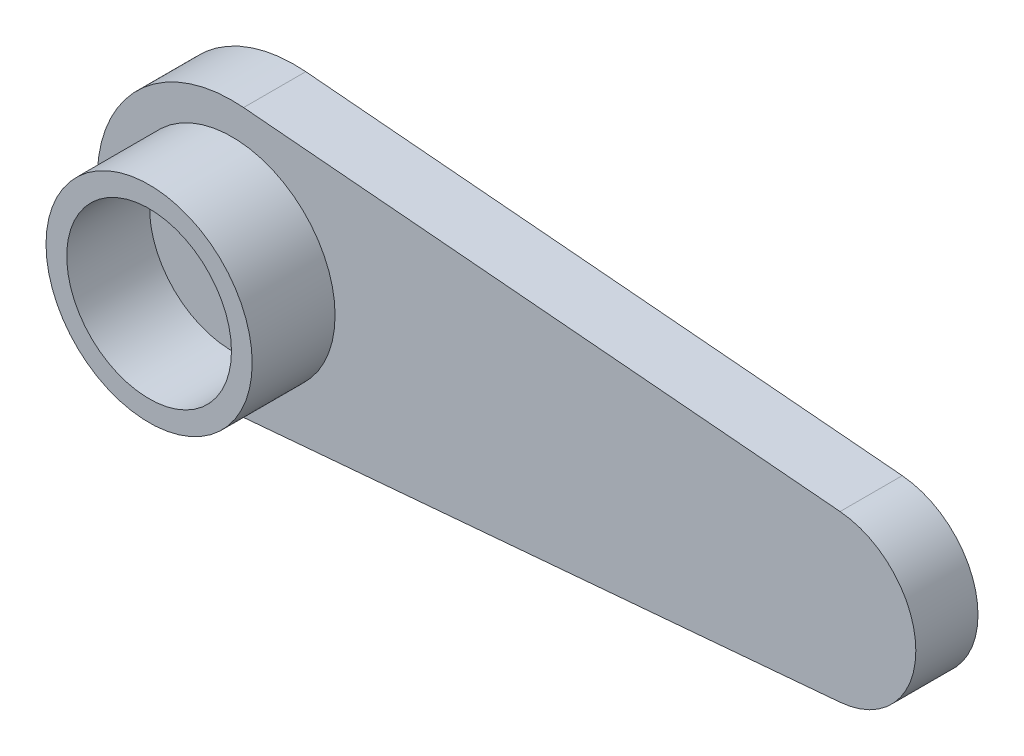
ISO-10303-21;
HEADER;
FILE_DESCRIPTION(('STEP AP214'),'2;1');
FILE_NAME('part.step','',(''),(''),'','','');
FILE_SCHEMA(('AUTOMOTIVE_DESIGN { 1 0 10303 214 1 1 1 1 }'));
ENDSEC;
DATA;
#1=APPLICATION_CONTEXT('core data for automotive mechanical design processes');
#2=APPLICATION_PROTOCOL_DEFINITION('international standard','automotive_design',2000,#1);
#3=PRODUCT_CONTEXT('',#1,'mechanical');
#4=PRODUCT('Part','Part','',(#3));
#5=PRODUCT_RELATED_PRODUCT_CATEGORY('part','',(#4));
#6=PRODUCT_DEFINITION_FORMATION('','',#4);
#7=PRODUCT_DEFINITION_CONTEXT('part definition',#1,'design');
#8=PRODUCT_DEFINITION('design','',#6,#7);
#9=PRODUCT_DEFINITION_SHAPE('','',#8);
#10=(LENGTH_UNIT() NAMED_UNIT(*) SI_UNIT(.MILLI.,.METRE.));
#11=(NAMED_UNIT(*) PLANE_ANGLE_UNIT() SI_UNIT($,.RADIAN.));
#12=(NAMED_UNIT(*) SI_UNIT($,.STERADIAN.) SOLID_ANGLE_UNIT());
#13=UNCERTAINTY_MEASURE_WITH_UNIT(LENGTH_MEASURE(1.E-05),#10,'distance_accuracy_value','');
#14=(GEOMETRIC_REPRESENTATION_CONTEXT(3) GLOBAL_UNCERTAINTY_ASSIGNED_CONTEXT((#13)) GLOBAL_UNIT_ASSIGNED_CONTEXT((#10,
#11,#12)) REPRESENTATION_CONTEXT('',''));
#15=CARTESIAN_POINT('',(0.,0.,0.));
#16=DIRECTION('',(0.,0.,1.));
#17=DIRECTION('',(1.,0.,0.));
#18=AXIS2_PLACEMENT_3D('',#15,#16,#17);
#19=CARTESIAN_POINT('',(-29.1805990323984,0.,3.));
#20=DIRECTION('',(0.,0.,-1.));
#21=DIRECTION('',(-1.,0.,0.));
#22=AXIS2_PLACEMENT_3D('',#19,#20,#21);
#23=CYLINDRICAL_SURFACE('',#22,6.5);
#24=CARTESIAN_POINT('',(-29.1805990323984,0.,0.));
#25=DIRECTION('',(0.,0.,1.));
#26=DIRECTION('',(1.,0.,0.));
#27=AXIS2_PLACEMENT_3D('',#24,#25,#26);
#28=CIRCLE('',#27,6.5);
#29=CARTESIAN_POINT('',(-28.6202542048122,6.47580216453509,0.));
#30=VERTEX_POINT('',#29);
#31=CARTESIAN_POINT('',(-28.6202542048122,-6.47580216453509,0.));
#32=VERTEX_POINT('',#31);
#33=EDGE_CURVE('E105',#30,#32,#28,.T.);
#34=ORIENTED_EDGE('',*,*,#33,.T.);
#35=DIRECTION('',(0.,0.,-1.));
#36=VECTOR('',#35,1.);
#37=CARTESIAN_POINT('',(-28.6202542048122,-6.47580216453509,3.));
#38=LINE('',#37,#36);
#39=CARTESIAN_POINT('',(-28.6202542048122,-6.47580216453509,3.));
#40=VERTEX_POINT('',#39);
#41=EDGE_CURVE('E42',#40,#32,#38,.T.);
#42=ORIENTED_EDGE('',*,*,#41,.F.);
#43=CARTESIAN_POINT('',(-29.1805990323984,0.,3.));
#44=DIRECTION('',(0.,0.,1.));
#45=DIRECTION('',(1.,0.,0.));
#46=AXIS2_PLACEMENT_3D('',#43,#44,#45);
#47=CIRCLE('',#46,6.5);
#48=CARTESIAN_POINT('',(-28.6202542048122,6.47580216453509,3.));
#49=VERTEX_POINT('',#48);
#50=EDGE_CURVE('E92',#49,#40,#47,.T.);
#51=ORIENTED_EDGE('',*,*,#50,.F.);
#52=DIRECTION('',(0.,0.,-1.));
#53=VECTOR('',#52,1.);
#54=CARTESIAN_POINT('',(-28.6202542048122,6.47580216453509,3.));
#55=LINE('',#54,#53);
#56=EDGE_CURVE('E101',#49,#30,#55,.T.);
#57=ORIENTED_EDGE('',*,*,#56,.T.);
#58=EDGE_LOOP('',(#34,#42,#51,#57));
#59=FACE_BOUND('',#58,.T.);
#60=ADVANCED_FACE('F39',(#59),#23,.T.);
#61=CARTESIAN_POINT('',(-28.6202542048122,-6.47580216453509,3.));
#62=DIRECTION('',(-0.0862068965517242,0.996277256082322,0.));
#63=DIRECTION('',(-0.996277256082322,-0.0862068965517242,0.));
#64=AXIS2_PLACEMENT_3D('',#61,#62,#63);
#65=PLANE('',#64);
#66=DIRECTION('',(0.996277256082322,0.0862068965517242,0.));
#67=VECTOR('',#66,1.);
#68=CARTESIAN_POINT('',(-28.6202542048122,-6.47580216453509,0.));
#69=LINE('',#68,#67);
#70=CARTESIAN_POINT('',(0.164228553808478,-3.98510902432929,0.));
#71=VERTEX_POINT('',#70);
#72=EDGE_CURVE('E97',#32,#71,#69,.T.);
#73=ORIENTED_EDGE('',*,*,#72,.T.);
#74=DIRECTION('',(0.,0.,-1.));
#75=VECTOR('',#74,1.);
#76=CARTESIAN_POINT('',(0.164228553808478,-3.98510902432929,3.));
#77=LINE('',#76,#75);
#78=CARTESIAN_POINT('',(0.164228553808478,-3.98510902432929,3.));
#79=VERTEX_POINT('',#78);
#80=EDGE_CURVE('E95',#79,#71,#77,.T.);
#81=ORIENTED_EDGE('',*,*,#80,.F.);
#82=DIRECTION('',(0.996277256082322,0.0862068965517242,0.));
#83=VECTOR('',#82,1.);
#84=CARTESIAN_POINT('',(-28.6202542048122,-6.47580216453509,3.));
#85=LINE('',#84,#83);
#86=EDGE_CURVE('E87',#40,#79,#85,.T.);
#87=ORIENTED_EDGE('',*,*,#86,.F.);
#88=ORIENTED_EDGE('',*,*,#41,.T.);
#89=EDGE_LOOP('',(#73,#81,#87,#88));
#90=FACE_BOUND('',#89,.T.);
#91=ADVANCED_FACE('F96',(#90),#65,.F.);
#92=CARTESIAN_POINT('',(-0.180599032398417,0.,3.));
#93=DIRECTION('',(0.,0.,-1.));
#94=DIRECTION('',(-1.,0.,0.));
#95=AXIS2_PLACEMENT_3D('',#92,#93,#94);
#96=CYLINDRICAL_SURFACE('',#95,4.);
#97=CARTESIAN_POINT('',(-0.180599032398417,0.,0.));
#98=DIRECTION('',(0.,0.,1.));
#99=DIRECTION('',(1.,0.,0.));
#100=AXIS2_PLACEMENT_3D('',#97,#98,#99);
#101=CIRCLE('',#100,4.);
#102=CARTESIAN_POINT('',(0.164228553808481,3.98510902432929,0.));
#103=VERTEX_POINT('',#102);
#104=EDGE_CURVE('E73',#71,#103,#101,.T.);
#105=ORIENTED_EDGE('',*,*,#104,.T.);
#106=DIRECTION('',(0.,0.,-1.));
#107=VECTOR('',#106,1.);
#108=CARTESIAN_POINT('',(0.164228553808481,3.98510902432929,3.));
#109=LINE('',#108,#107);
#110=CARTESIAN_POINT('',(0.164228553808481,3.98510902432929,3.));
#111=VERTEX_POINT('',#110);
#112=EDGE_CURVE('E98',#111,#103,#109,.T.);
#113=ORIENTED_EDGE('',*,*,#112,.F.);
#114=CARTESIAN_POINT('',(-0.180599032398417,0.,3.));
#115=DIRECTION('',(0.,0.,1.));
#116=DIRECTION('',(1.,0.,0.));
#117=AXIS2_PLACEMENT_3D('',#114,#115,#116);
#118=CIRCLE('',#117,4.);
#119=EDGE_CURVE('E90',#79,#111,#118,.T.);
#120=ORIENTED_EDGE('',*,*,#119,.F.);
#121=ORIENTED_EDGE('',*,*,#80,.T.);
#122=EDGE_LOOP('',(#105,#113,#120,#121));
#123=FACE_BOUND('',#122,.T.);
#124=ADVANCED_FACE('F99',(#123),#96,.T.);
#125=CARTESIAN_POINT('',(-28.6202542048122,6.47580216453509,3.));
#126=DIRECTION('',(-0.0862068965517242,-0.996277256082322,0.));
#127=DIRECTION('',(0.996277256082322,-0.0862068965517242,0.));
#128=AXIS2_PLACEMENT_3D('',#125,#126,#127);
#129=PLANE('',#128);
#130=DIRECTION('',(-0.996277256082322,0.0862068965517242,0.));
#131=VECTOR('',#130,1.);
#132=CARTESIAN_POINT('',(-28.6202542048122,6.47580216453509,0.));
#133=LINE('',#132,#131);
#134=EDGE_CURVE('E79',#103,#30,#133,.T.);
#135=ORIENTED_EDGE('',*,*,#134,.T.);
#136=ORIENTED_EDGE('',*,*,#56,.F.);
#137=DIRECTION('',(-0.996277256082322,0.0862068965517242,0.));
#138=VECTOR('',#137,1.);
#139=CARTESIAN_POINT('',(-28.6202542048122,6.47580216453509,3.));
#140=LINE('',#139,#138);
#141=EDGE_CURVE('E56',#111,#49,#140,.T.);
#142=ORIENTED_EDGE('',*,*,#141,.F.);
#143=ORIENTED_EDGE('',*,*,#112,.T.);
#144=EDGE_LOOP('',(#135,#136,#142,#143));
#145=FACE_BOUND('',#144,.T.);
#146=ADVANCED_FACE('F113',(#145),#129,.F.);
#147=CARTESIAN_POINT('',(-29.1805990323984,0.,3.));
#148=DIRECTION('',(0.,0.,1.));
#149=DIRECTION('',(1.,0.,0.));
#150=AXIS2_PLACEMENT_3D('',#147,#148,#149);
#151=PLANE('',#150);
#152=CARTESIAN_POINT('',(-29.1805990323984,0.,3.));
#153=DIRECTION('',(0.,0.,1.));
#154=DIRECTION('',(1.,0.,0.));
#155=AXIS2_PLACEMENT_3D('',#152,#153,#154);
#156=CIRCLE('',#155,4.975);
#157=CARTESIAN_POINT('',(-24.2055990323984,0.,3.));
#158=VERTEX_POINT('',#157);
#159=EDGE_CURVE('E12',#158,#158,#156,.T.);
#160=ORIENTED_EDGE('',*,*,#159,.F.);
#161=EDGE_LOOP('',(#160));
#162=FACE_BOUND('',#161,.T.);
#163=ORIENTED_EDGE('',*,*,#50,.T.);
#164=ORIENTED_EDGE('',*,*,#86,.T.);
#165=ORIENTED_EDGE('',*,*,#119,.T.);
#166=ORIENTED_EDGE('',*,*,#141,.T.);
#167=EDGE_LOOP('',(#163,#164,#165,#166));
#168=FACE_BOUND('',#167,.T.);
#169=ADVANCED_FACE('F88',(#162,#168),#151,.T.);
#170=CARTESIAN_POINT('',(-29.1805990323984,0.,0.));
#171=DIRECTION('',(0.,0.,1.));
#172=DIRECTION('',(1.,0.,0.));
#173=AXIS2_PLACEMENT_3D('',#170,#171,#172);
#174=PLANE('',#173);
#175=ORIENTED_EDGE('',*,*,#33,.F.);
#176=ORIENTED_EDGE('',*,*,#134,.F.);
#177=ORIENTED_EDGE('',*,*,#104,.F.);
#178=ORIENTED_EDGE('',*,*,#72,.F.);
#179=EDGE_LOOP('',(#175,#176,#177,#178));
#180=FACE_BOUND('',#179,.T.);
#181=ADVANCED_FACE('F116',(#180),#174,.F.);
#182=CARTESIAN_POINT('',(-29.1805990323984,0.,7.));
#183=DIRECTION('',(0.,0.,1.));
#184=DIRECTION('',(1.,0.,0.));
#185=AXIS2_PLACEMENT_3D('',#182,#183,#184);
#186=PLANE('',#185);
#187=CARTESIAN_POINT('',(-29.1805990323984,0.,7.));
#188=DIRECTION('',(0.,0.,1.));
#189=DIRECTION('',(1.,0.,0.));
#190=AXIS2_PLACEMENT_3D('',#187,#188,#189);
#191=CIRCLE('',#190,4.975);
#192=CARTESIAN_POINT('',(-24.2055990323984,0.,7.));
#193=VERTEX_POINT('',#192);
#194=EDGE_CURVE('E108',#193,#193,#191,.T.);
#195=ORIENTED_EDGE('',*,*,#194,.T.);
#196=EDGE_LOOP('',(#195));
#197=FACE_BOUND('',#196,.T.);
#198=CARTESIAN_POINT('',(-29.1805990323984,0.,7.));
#199=DIRECTION('',(0.,0.,1.));
#200=DIRECTION('',(1.,0.,0.));
#201=AXIS2_PLACEMENT_3D('',#198,#199,#200);
#202=CIRCLE('',#201,3.975);
#203=CARTESIAN_POINT('',(-25.2055990323984,0.,7.));
#204=VERTEX_POINT('',#203);
#205=EDGE_CURVE('E121',#204,#204,#202,.T.);
#206=ORIENTED_EDGE('',*,*,#205,.F.);
#207=EDGE_LOOP('',(#206));
#208=FACE_BOUND('',#207,.T.);
#209=ADVANCED_FACE('F131',(#197,#208),#186,.T.);
#210=CARTESIAN_POINT('',(-29.1805990323984,0.,7.));
#211=DIRECTION('',(0.,0.,-1.));
#212=DIRECTION('',(-1.,0.,0.));
#213=AXIS2_PLACEMENT_3D('',#210,#211,#212);
#214=CYLINDRICAL_SURFACE('',#213,4.975);
#215=ORIENTED_EDGE('',*,*,#194,.F.);
#216=EDGE_LOOP('',(#215));
#217=FACE_BOUND('',#216,.T.);
#218=ORIENTED_EDGE('',*,*,#159,.T.);
#219=EDGE_LOOP('',(#218));
#220=FACE_BOUND('',#219,.T.);
#221=ADVANCED_FACE('F133',(#217,#220),#214,.T.);
#222=CARTESIAN_POINT('',(-29.1805990323984,0.,7.));
#223=DIRECTION('',(0.,0.,-1.));
#224=DIRECTION('',(-1.,0.,0.));
#225=AXIS2_PLACEMENT_3D('',#222,#223,#224);
#226=CYLINDRICAL_SURFACE('',#225,3.975);
#227=ORIENTED_EDGE('',*,*,#205,.T.);
#228=EDGE_LOOP('',(#227));
#229=FACE_BOUND('',#228,.T.);
#230=CARTESIAN_POINT('',(-29.1805990323984,0.,3.));
#231=DIRECTION('',(0.,0.,1.));
#232=DIRECTION('',(1.,0.,0.));
#233=AXIS2_PLACEMENT_3D('',#230,#231,#232);
#234=CIRCLE('',#233,3.975);
#235=CARTESIAN_POINT('',(-25.2055990323984,0.,3.));
#236=VERTEX_POINT('',#235);
#237=EDGE_CURVE('E122',#236,#236,#234,.T.);
#238=ORIENTED_EDGE('',*,*,#237,.F.);
#239=EDGE_LOOP('',(#238));
#240=FACE_BOUND('',#239,.T.);
#241=ADVANCED_FACE('F128',(#229,#240),#226,.F.);
#242=ORIENTED_EDGE('',*,*,#237,.T.);
#243=EDGE_LOOP('',(#242));
#244=FACE_BOUND('',#243,.T.);
#245=ADVANCED_FACE('F158',(#244),#151,.T.);
#246=CLOSED_SHELL('',(#60,#91,#124,#146,#169,#181,#209,#221,#241,#245));
#247=MANIFOLD_SOLID_BREP('B2',#246);
#248=ADVANCED_BREP_SHAPE_REPRESENTATION('',(#18,#247),#14);
#249=SHAPE_DEFINITION_REPRESENTATION(#9,#248);
ENDSEC;
END-ISO-10303-21;
